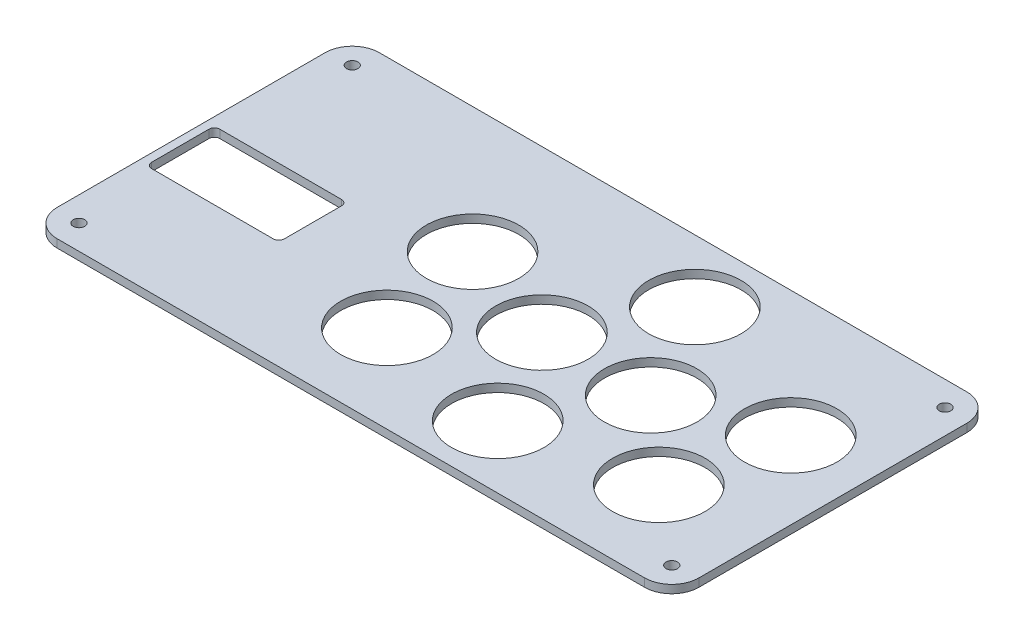
ISO-10303-21;
HEADER;
FILE_DESCRIPTION(('STEP AP214'),'2;1');
FILE_NAME('part.step','',(''),(''),'','','');
FILE_SCHEMA(('AUTOMOTIVE_DESIGN { 1 0 10303 214 1 1 1 1 }'));
ENDSEC;
DATA;
#1=APPLICATION_CONTEXT('core data for automotive mechanical design processes');
#2=APPLICATION_PROTOCOL_DEFINITION('international standard','automotive_design',2000,#1);
#3=PRODUCT_CONTEXT('',#1,'mechanical');
#4=PRODUCT('Part','Part','',(#3));
#5=PRODUCT_RELATED_PRODUCT_CATEGORY('part','',(#4));
#6=PRODUCT_DEFINITION_FORMATION('','',#4);
#7=PRODUCT_DEFINITION_CONTEXT('part definition',#1,'design');
#8=PRODUCT_DEFINITION('design','',#6,#7);
#9=PRODUCT_DEFINITION_SHAPE('','',#8);
#10=(LENGTH_UNIT() NAMED_UNIT(*) SI_UNIT(.MILLI.,.METRE.));
#11=(NAMED_UNIT(*) PLANE_ANGLE_UNIT() SI_UNIT($,.RADIAN.));
#12=(NAMED_UNIT(*) SI_UNIT($,.STERADIAN.) SOLID_ANGLE_UNIT());
#13=UNCERTAINTY_MEASURE_WITH_UNIT(LENGTH_MEASURE(1.E-05),#10,'distance_accuracy_value','');
#14=(GEOMETRIC_REPRESENTATION_CONTEXT(3) GLOBAL_UNCERTAINTY_ASSIGNED_CONTEXT((#13)) GLOBAL_UNIT_ASSIGNED_CONTEXT((#10,
#11,#12)) REPRESENTATION_CONTEXT('',''));
#15=CARTESIAN_POINT('',(0.,0.,0.));
#16=DIRECTION('',(0.,0.,1.));
#17=DIRECTION('',(1.,0.,0.));
#18=AXIS2_PLACEMENT_3D('',#15,#16,#17);
#19=CARTESIAN_POINT('',(0.,3.,-100.826085020235));
#20=DIRECTION('',(0.,0.,-1.));
#21=DIRECTION('',(-1.,0.,0.));
#22=AXIS2_PLACEMENT_3D('',#19,#20,#21);
#23=PLANE('',#22);
#24=DIRECTION('',(1.,0.,0.));
#25=VECTOR('',#24,1.);
#26=CARTESIAN_POINT('',(0.,3.,-100.826085020235));
#27=LINE('',#26,#25);
#28=CARTESIAN_POINT('',(-43.6645036271575,3.,-100.826085020235));
#29=VERTEX_POINT('',#28);
#30=CARTESIAN_POINT('',(172.335496372842,3.,-100.826085020235));
#31=VERTEX_POINT('',#30);
#32=EDGE_CURVE('E315',#29,#31,#27,.T.);
#33=ORIENTED_EDGE('',*,*,#32,.T.);
#34=DIRECTION('',(0.,-1.,0.));
#35=VECTOR('',#34,1.);
#36=CARTESIAN_POINT('',(172.335496372842,3.,-100.826085020235));
#37=LINE('',#36,#35);
#38=CARTESIAN_POINT('',(172.335496372842,0.,-100.826085020235));
#39=VERTEX_POINT('',#38);
#40=EDGE_CURVE('E207',#31,#39,#37,.T.);
#41=ORIENTED_EDGE('',*,*,#40,.T.);
#42=DIRECTION('',(1.,0.,0.));
#43=VECTOR('',#42,1.);
#44=CARTESIAN_POINT('',(0.,0.,-100.826085020235));
#45=LINE('',#44,#43);
#46=CARTESIAN_POINT('',(-43.6645036271575,0.,-100.826085020235));
#47=VERTEX_POINT('',#46);
#48=EDGE_CURVE('E165',#47,#39,#45,.T.);
#49=ORIENTED_EDGE('',*,*,#48,.F.);
#50=DIRECTION('',(0.,-1.,0.));
#51=VECTOR('',#50,1.);
#52=CARTESIAN_POINT('',(-43.6645036271575,3.,-100.826085020235));
#53=LINE('',#52,#51);
#54=EDGE_CURVE('E210',#47,#29,#53,.F.);
#55=ORIENTED_EDGE('',*,*,#54,.T.);
#56=EDGE_LOOP('',(#33,#41,#49,#55));
#57=FACE_BOUND('',#56,.T.);
#58=ADVANCED_FACE('F43',(#57),#23,.T.);
#59=CARTESIAN_POINT('',(-53.6645036271575,3.,0.));
#60=DIRECTION('',(1.,0.,0.));
#61=DIRECTION('',(0.,0.,-1.));
#62=AXIS2_PLACEMENT_3D('',#59,#60,#61);
#63=PLANE('',#62);
#64=DIRECTION('',(0.,0.,1.));
#65=VECTOR('',#64,1.);
#66=CARTESIAN_POINT('',(-53.6645036271575,3.,0.));
#67=LINE('',#66,#65);
#68=CARTESIAN_POINT('',(-53.6645036271575,3.,-90.8260850202347));
#69=VERTEX_POINT('',#68);
#70=CARTESIAN_POINT('',(-53.6645036271575,3.,7.67391497976526));
#71=VERTEX_POINT('',#70);
#72=EDGE_CURVE('E312',#69,#71,#67,.T.);
#73=ORIENTED_EDGE('',*,*,#72,.F.);
#74=DIRECTION('',(0.,-1.,0.));
#75=VECTOR('',#74,1.);
#76=CARTESIAN_POINT('',(-53.6645036271575,0.,-90.8260850202347));
#77=LINE('',#76,#75);
#78=CARTESIAN_POINT('',(-53.6645036271575,0.,-90.8260850202347));
#79=VERTEX_POINT('',#78);
#80=EDGE_CURVE('E213',#69,#79,#77,.T.);
#81=ORIENTED_EDGE('',*,*,#80,.T.);
#82=DIRECTION('',(0.,0.,1.));
#83=VECTOR('',#82,1.);
#84=CARTESIAN_POINT('',(-53.6645036271575,0.,0.));
#85=LINE('',#84,#83);
#86=CARTESIAN_POINT('',(-53.6645036271575,0.,7.67391497976526));
#87=VERTEX_POINT('',#86);
#88=EDGE_CURVE('E361',#79,#87,#85,.T.);
#89=ORIENTED_EDGE('',*,*,#88,.T.);
#90=DIRECTION('',(0.,-1.,0.));
#91=VECTOR('',#90,1.);
#92=CARTESIAN_POINT('',(-53.6645036271575,3.,7.67391497976526));
#93=LINE('',#92,#91);
#94=EDGE_CURVE('E211',#87,#71,#93,.F.);
#95=ORIENTED_EDGE('',*,*,#94,.T.);
#96=EDGE_LOOP('',(#73,#81,#89,#95));
#97=FACE_BOUND('',#96,.T.);
#98=ADVANCED_FACE('F382',(#97),#63,.F.);
#99=CARTESIAN_POINT('',(0.,3.,17.6739149797653));
#100=DIRECTION('',(0.,0.,-1.));
#101=DIRECTION('',(-1.,0.,0.));
#102=AXIS2_PLACEMENT_3D('',#99,#100,#101);
#103=PLANE('',#102);
#104=DIRECTION('',(1.,0.,0.));
#105=VECTOR('',#104,1.);
#106=CARTESIAN_POINT('',(0.,0.,17.6739149797653));
#107=LINE('',#106,#105);
#108=CARTESIAN_POINT('',(-43.6645036271575,0.,17.6739149797653));
#109=VERTEX_POINT('',#108);
#110=CARTESIAN_POINT('',(172.335496372843,0.,17.6739149797653));
#111=VERTEX_POINT('',#110);
#112=EDGE_CURVE('E178',#109,#111,#107,.T.);
#113=ORIENTED_EDGE('',*,*,#112,.T.);
#114=DIRECTION('',(0.,-1.,0.));
#115=VECTOR('',#114,1.);
#116=CARTESIAN_POINT('',(172.335496372843,3.,17.6739149797653));
#117=LINE('',#116,#115);
#118=CARTESIAN_POINT('',(172.335496372843,3.,17.6739149797653));
#119=VERTEX_POINT('',#118);
#120=EDGE_CURVE('E196',#111,#119,#117,.F.);
#121=ORIENTED_EDGE('',*,*,#120,.T.);
#122=DIRECTION('',(1.,0.,0.));
#123=VECTOR('',#122,1.);
#124=CARTESIAN_POINT('',(0.,3.,17.6739149797653));
#125=LINE('',#124,#123);
#126=CARTESIAN_POINT('',(-43.6645036271575,3.,17.6739149797653));
#127=VERTEX_POINT('',#126);
#128=EDGE_CURVE('E187',#127,#119,#125,.T.);
#129=ORIENTED_EDGE('',*,*,#128,.F.);
#130=DIRECTION('',(0.,-1.,0.));
#131=VECTOR('',#130,1.);
#132=CARTESIAN_POINT('',(-43.6645036271575,3.,17.6739149797653));
#133=LINE('',#132,#131);
#134=EDGE_CURVE('E194',#127,#109,#133,.T.);
#135=ORIENTED_EDGE('',*,*,#134,.T.);
#136=EDGE_LOOP('',(#113,#121,#129,#135));
#137=FACE_BOUND('',#136,.T.);
#138=ADVANCED_FACE('F369',(#137),#103,.F.);
#139=CARTESIAN_POINT('',(-50.6645036271575,3.,0.));
#140=DIRECTION('',(1.,0.,0.));
#141=DIRECTION('',(0.,0.,-1.));
#142=AXIS2_PLACEMENT_3D('',#139,#140,#141);
#143=PLANE('',#142);
#144=DIRECTION('',(0.,0.,1.));
#145=VECTOR('',#144,1.);
#146=CARTESIAN_POINT('',(-50.6645036271575,3.,0.));
#147=LINE('',#146,#145);
#148=CARTESIAN_POINT('',(-50.6645036271575,3.,-45.1260850202347));
#149=VERTEX_POINT('',#148);
#150=CARTESIAN_POINT('',(-50.6645036271575,3.,-24.0260850202347));
#151=VERTEX_POINT('',#150);
#152=EDGE_CURVE('E177',#149,#151,#147,.T.);
#153=ORIENTED_EDGE('',*,*,#152,.T.);
#154=DIRECTION('',(0.,-1.,0.));
#155=VECTOR('',#154,1.);
#156=CARTESIAN_POINT('',(-50.6645036271575,0.,-24.0260850202347));
#157=LINE('',#156,#155);
#158=CARTESIAN_POINT('',(-50.6645036271575,0.,-24.0260850202347));
#159=VERTEX_POINT('',#158);
#160=EDGE_CURVE('E227',#151,#159,#157,.T.);
#161=ORIENTED_EDGE('',*,*,#160,.T.);
#162=DIRECTION('',(0.,0.,1.));
#163=VECTOR('',#162,1.);
#164=CARTESIAN_POINT('',(-50.6645036271575,0.,0.));
#165=LINE('',#164,#163);
#166=CARTESIAN_POINT('',(-50.6645036271575,0.,-45.1260850202347));
#167=VERTEX_POINT('',#166);
#168=EDGE_CURVE('E258',#167,#159,#165,.T.);
#169=ORIENTED_EDGE('',*,*,#168,.F.);
#170=DIRECTION('',(0.,-1.,0.));
#171=VECTOR('',#170,1.);
#172=CARTESIAN_POINT('',(-50.6645036271575,3.,-45.1260850202347));
#173=LINE('',#172,#171);
#174=EDGE_CURVE('E228',#167,#149,#173,.F.);
#175=ORIENTED_EDGE('',*,*,#174,.T.);
#176=EDGE_LOOP('',(#153,#161,#169,#175));
#177=FACE_BOUND('',#176,.T.);
#178=ADVANCED_FACE('F454',(#177),#143,.T.);
#179=CARTESIAN_POINT('',(0.,3.,-47.1260850202347));
#180=DIRECTION('',(0.,0.,-1.));
#181=DIRECTION('',(-1.,0.,0.));
#182=AXIS2_PLACEMENT_3D('',#179,#180,#181);
#183=PLANE('',#182);
#184=DIRECTION('',(1.,0.,0.));
#185=VECTOR('',#184,1.);
#186=CARTESIAN_POINT('',(0.,3.,-47.1260850202347));
#187=LINE('',#186,#185);
#188=CARTESIAN_POINT('',(-48.6645036271575,3.,-47.1260850202347));
#189=VERTEX_POINT('',#188);
#190=CARTESIAN_POINT('',(-3.86450362715749,3.,-47.1260850202347));
#191=VERTEX_POINT('',#190);
#192=EDGE_CURVE('E264',#189,#191,#187,.T.);
#193=ORIENTED_EDGE('',*,*,#192,.F.);
#194=DIRECTION('',(0.,-1.,0.));
#195=VECTOR('',#194,1.);
#196=CARTESIAN_POINT('',(-48.6645036271575,3.,-47.1260850202347));
#197=LINE('',#196,#195);
#198=CARTESIAN_POINT('',(-48.6645036271575,0.,-47.1260850202347));
#199=VERTEX_POINT('',#198);
#200=EDGE_CURVE('E235',#189,#199,#197,.T.);
#201=ORIENTED_EDGE('',*,*,#200,.T.);
#202=DIRECTION('',(1.,0.,0.));
#203=VECTOR('',#202,1.);
#204=CARTESIAN_POINT('',(0.,0.,-47.1260850202347));
#205=LINE('',#204,#203);
#206=CARTESIAN_POINT('',(-3.86450362715749,0.,-47.1260850202347));
#207=VERTEX_POINT('',#206);
#208=EDGE_CURVE('E248',#199,#207,#205,.T.);
#209=ORIENTED_EDGE('',*,*,#208,.T.);
#210=DIRECTION('',(0.,-1.,0.));
#211=VECTOR('',#210,1.);
#212=CARTESIAN_POINT('',(-3.86450362715749,3.,-47.1260850202347));
#213=LINE('',#212,#211);
#214=EDGE_CURVE('E59',#207,#191,#213,.F.);
#215=ORIENTED_EDGE('',*,*,#214,.T.);
#216=EDGE_LOOP('',(#193,#201,#209,#215));
#217=FACE_BOUND('',#216,.T.);
#218=ADVANCED_FACE('F255',(#217),#183,.F.);
#219=CARTESIAN_POINT('',(-1.86450362715748,3.,0.));
#220=DIRECTION('',(1.,0.,0.));
#221=DIRECTION('',(0.,0.,-1.));
#222=AXIS2_PLACEMENT_3D('',#219,#220,#221);
#223=PLANE('',#222);
#224=DIRECTION('',(0.,0.,1.));
#225=VECTOR('',#224,1.);
#226=CARTESIAN_POINT('',(-1.86450362715748,0.,0.));
#227=LINE('',#226,#225);
#228=CARTESIAN_POINT('',(-1.86450362715749,0.,-45.1260850202347));
#229=VERTEX_POINT('',#228);
#230=CARTESIAN_POINT('',(-1.86450362715748,0.,-24.0260850202347));
#231=VERTEX_POINT('',#230);
#232=EDGE_CURVE('E253',#229,#231,#227,.T.);
#233=ORIENTED_EDGE('',*,*,#232,.T.);
#234=DIRECTION('',(0.,-1.,0.));
#235=VECTOR('',#234,1.);
#236=CARTESIAN_POINT('',(-1.86450362715748,3.,-24.0260850202347));
#237=LINE('',#236,#235);
#238=CARTESIAN_POINT('',(-1.86450362715748,3.,-24.0260850202347));
#239=VERTEX_POINT('',#238);
#240=EDGE_CURVE('E221',#231,#239,#237,.F.);
#241=ORIENTED_EDGE('',*,*,#240,.T.);
#242=DIRECTION('',(0.,0.,1.));
#243=VECTOR('',#242,1.);
#244=CARTESIAN_POINT('',(-1.86450362715748,3.,0.));
#245=LINE('',#244,#243);
#246=CARTESIAN_POINT('',(-1.86450362715749,3.,-45.1260850202347));
#247=VERTEX_POINT('',#246);
#248=EDGE_CURVE('E263',#247,#239,#245,.T.);
#249=ORIENTED_EDGE('',*,*,#248,.F.);
#250=DIRECTION('',(0.,-1.,0.));
#251=VECTOR('',#250,1.);
#252=CARTESIAN_POINT('',(-1.86450362715749,0.,-45.1260850202347));
#253=LINE('',#252,#251);
#254=EDGE_CURVE('E222',#247,#229,#253,.T.);
#255=ORIENTED_EDGE('',*,*,#254,.T.);
#256=EDGE_LOOP('',(#233,#241,#249,#255));
#257=FACE_BOUND('',#256,.T.);
#258=ADVANCED_FACE('F270',(#257),#223,.F.);
#259=CARTESIAN_POINT('',(173.335496372843,3.,8.6739149797652));
#260=DIRECTION('',(0.,-1.,0.));
#261=DIRECTION('',(0.,0.,-1.));
#262=AXIS2_PLACEMENT_3D('',#259,#260,#261);
#263=CYLINDRICAL_SURFACE('',#262,2.125);
#264=CARTESIAN_POINT('',(173.335496372843,3.,8.6739149797652));
#265=DIRECTION('',(0.,1.,0.));
#266=DIRECTION('',(0.,0.,1.));
#267=AXIS2_PLACEMENT_3D('',#264,#265,#266);
#268=CIRCLE('',#267,2.125);
#269=CARTESIAN_POINT('',(173.335496372843,3.,10.7989149797652));
#270=VERTEX_POINT('',#269);
#271=EDGE_CURVE('E310',#270,#270,#268,.F.);
#272=ORIENTED_EDGE('',*,*,#271,.F.);
#273=EDGE_LOOP('',(#272));
#274=FACE_BOUND('',#273,.T.);
#275=CARTESIAN_POINT('',(173.335496372843,0.,8.6739149797652));
#276=DIRECTION('',(0.,1.,0.));
#277=DIRECTION('',(0.,0.,1.));
#278=AXIS2_PLACEMENT_3D('',#275,#276,#277);
#279=CIRCLE('',#278,2.125);
#280=CARTESIAN_POINT('',(173.335496372843,0.,10.7989149797652));
#281=VERTEX_POINT('',#280);
#282=EDGE_CURVE('E358',#281,#281,#279,.F.);
#283=ORIENTED_EDGE('',*,*,#282,.T.);
#284=EDGE_LOOP('',(#283));
#285=FACE_BOUND('',#284,.T.);
#286=ADVANCED_FACE('F399',(#274,#285),#263,.F.);
#287=CARTESIAN_POINT('',(173.335496372842,3.,-91.8260850202348));
#288=DIRECTION('',(0.,-1.,0.));
#289=DIRECTION('',(0.,0.,-1.));
#290=AXIS2_PLACEMENT_3D('',#287,#288,#289);
#291=CYLINDRICAL_SURFACE('',#290,2.125);
#292=CARTESIAN_POINT('',(173.335496372842,3.,-91.8260850202348));
#293=DIRECTION('',(0.,1.,0.));
#294=DIRECTION('',(0.,0.,1.));
#295=AXIS2_PLACEMENT_3D('',#292,#293,#294);
#296=CIRCLE('',#295,2.125);
#297=CARTESIAN_POINT('',(173.335496372842,3.,-89.7010850202348));
#298=VERTEX_POINT('',#297);
#299=EDGE_CURVE('E308',#298,#298,#296,.T.);
#300=ORIENTED_EDGE('',*,*,#299,.T.);
#301=EDGE_LOOP('',(#300));
#302=FACE_BOUND('',#301,.T.);
#303=CARTESIAN_POINT('',(173.335496372842,0.,-91.8260850202348));
#304=DIRECTION('',(0.,1.,0.));
#305=DIRECTION('',(0.,0.,1.));
#306=AXIS2_PLACEMENT_3D('',#303,#304,#305);
#307=CIRCLE('',#306,2.125);
#308=CARTESIAN_POINT('',(173.335496372842,0.,-89.7010850202348));
#309=VERTEX_POINT('',#308);
#310=EDGE_CURVE('E356',#309,#309,#307,.T.);
#311=ORIENTED_EDGE('',*,*,#310,.F.);
#312=EDGE_LOOP('',(#311));
#313=FACE_BOUND('',#312,.T.);
#314=ADVANCED_FACE('F401',(#302,#313),#291,.F.);
#315=CARTESIAN_POINT('',(36.8354963728425,3.,-54.5760850202347));
#316=DIRECTION('',(0.,-1.,0.));
#317=DIRECTION('',(0.,0.,-1.));
#318=AXIS2_PLACEMENT_3D('',#315,#316,#317);
#319=CYLINDRICAL_SURFACE('',#318,17.);
#320=CARTESIAN_POINT('',(36.8354963728425,3.,-54.5760850202347));
#321=DIRECTION('',(0.,1.,0.));
#322=DIRECTION('',(0.,0.,1.));
#323=AXIS2_PLACEMENT_3D('',#320,#321,#322);
#324=CIRCLE('',#323,17.);
#325=CARTESIAN_POINT('',(36.8354963728425,3.,-37.5760850202347));
#326=VERTEX_POINT('',#325);
#327=EDGE_CURVE('E302',#326,#326,#324,.T.);
#328=ORIENTED_EDGE('',*,*,#327,.T.);
#329=EDGE_LOOP('',(#328));
#330=FACE_BOUND('',#329,.T.);
#331=CARTESIAN_POINT('',(36.8354963728425,0.,-54.5760850202347));
#332=DIRECTION('',(0.,1.,0.));
#333=DIRECTION('',(0.,0.,1.));
#334=AXIS2_PLACEMENT_3D('',#331,#332,#333);
#335=CIRCLE('',#334,17.);
#336=CARTESIAN_POINT('',(36.8354963728425,0.,-37.5760850202347));
#337=VERTEX_POINT('',#336);
#338=EDGE_CURVE('E352',#337,#337,#335,.T.);
#339=ORIENTED_EDGE('',*,*,#338,.F.);
#340=EDGE_LOOP('',(#339));
#341=FACE_BOUND('',#340,.T.);
#342=ADVANCED_FACE('F409',(#330,#341),#319,.F.);
#343=CARTESIAN_POINT('',(45.3354963728425,3.,-14.5760850202347));
#344=DIRECTION('',(0.,-1.,0.));
#345=DIRECTION('',(0.,0.,-1.));
#346=AXIS2_PLACEMENT_3D('',#343,#344,#345);
#347=CYLINDRICAL_SURFACE('',#346,17.);
#348=CARTESIAN_POINT('',(45.3354963728425,3.,-14.5760850202347));
#349=DIRECTION('',(0.,1.,0.));
#350=DIRECTION('',(0.,0.,1.));
#351=AXIS2_PLACEMENT_3D('',#348,#349,#350);
#352=CIRCLE('',#351,17.);
#353=CARTESIAN_POINT('',(45.3354963728425,3.,2.42391497976526));
#354=VERTEX_POINT('',#353);
#355=EDGE_CURVE('E296',#354,#354,#352,.T.);
#356=ORIENTED_EDGE('',*,*,#355,.T.);
#357=EDGE_LOOP('',(#356));
#358=FACE_BOUND('',#357,.T.);
#359=CARTESIAN_POINT('',(45.3354963728425,0.,-14.5760850202347));
#360=DIRECTION('',(0.,1.,0.));
#361=DIRECTION('',(0.,0.,1.));
#362=AXIS2_PLACEMENT_3D('',#359,#360,#361);
#363=CIRCLE('',#362,17.);
#364=CARTESIAN_POINT('',(45.3354963728425,0.,2.42391497976526));
#365=VERTEX_POINT('',#364);
#366=EDGE_CURVE('E348',#365,#365,#363,.T.);
#367=ORIENTED_EDGE('',*,*,#366,.F.);
#368=EDGE_LOOP('',(#367));
#369=FACE_BOUND('',#368,.T.);
#370=ADVANCED_FACE('F411',(#358,#369),#347,.F.);
#371=CARTESIAN_POINT('',(145.335496372843,3.,-14.5760850202347));
#372=DIRECTION('',(0.,-1.,0.));
#373=DIRECTION('',(0.,0.,-1.));
#374=AXIS2_PLACEMENT_3D('',#371,#372,#373);
#375=CYLINDRICAL_SURFACE('',#374,17.);
#376=CARTESIAN_POINT('',(145.335496372843,3.,-14.5760850202347));
#377=DIRECTION('',(0.,1.,0.));
#378=DIRECTION('',(0.,0.,1.));
#379=AXIS2_PLACEMENT_3D('',#376,#377,#378);
#380=CIRCLE('',#379,17.);
#381=CARTESIAN_POINT('',(145.335496372843,3.,2.42391497976525));
#382=VERTEX_POINT('',#381);
#383=EDGE_CURVE('E299',#382,#382,#380,.T.);
#384=ORIENTED_EDGE('',*,*,#383,.T.);
#385=EDGE_LOOP('',(#384));
#386=FACE_BOUND('',#385,.T.);
#387=CARTESIAN_POINT('',(145.335496372843,0.,-14.5760850202347));
#388=DIRECTION('',(0.,1.,0.));
#389=DIRECTION('',(0.,0.,1.));
#390=AXIS2_PLACEMENT_3D('',#387,#388,#389);
#391=CIRCLE('',#390,17.);
#392=CARTESIAN_POINT('',(145.335496372843,0.,2.42391497976525));
#393=VERTEX_POINT('',#392);
#394=EDGE_CURVE('E350',#393,#393,#391,.T.);
#395=ORIENTED_EDGE('',*,*,#394,.F.);
#396=EDGE_LOOP('',(#395));
#397=FACE_BOUND('',#396,.T.);
#398=ADVANCED_FACE('F414',(#386,#397),#375,.F.);
#399=CARTESIAN_POINT('',(75.3354963728425,3.,-41.5760850202347));
#400=DIRECTION('',(0.,-1.,0.));
#401=DIRECTION('',(0.,0.,-1.));
#402=AXIS2_PLACEMENT_3D('',#399,#400,#401);
#403=CYLINDRICAL_SURFACE('',#402,17.);
#404=CARTESIAN_POINT('',(75.3354963728425,3.,-41.5760850202347));
#405=DIRECTION('',(0.,1.,0.));
#406=DIRECTION('',(0.,0.,1.));
#407=AXIS2_PLACEMENT_3D('',#404,#405,#406);
#408=CIRCLE('',#407,17.);
#409=CARTESIAN_POINT('',(75.3354963728425,3.,-24.5760850202347));
#410=VERTEX_POINT('',#409);
#411=EDGE_CURVE('E294',#410,#410,#408,.T.);
#412=ORIENTED_EDGE('',*,*,#411,.T.);
#413=EDGE_LOOP('',(#412));
#414=FACE_BOUND('',#413,.T.);
#415=CARTESIAN_POINT('',(75.3354963728425,0.,-41.5760850202347));
#416=DIRECTION('',(0.,1.,0.));
#417=DIRECTION('',(0.,0.,1.));
#418=AXIS2_PLACEMENT_3D('',#415,#416,#417);
#419=CIRCLE('',#418,17.);
#420=CARTESIAN_POINT('',(75.3354963728425,0.,-24.5760850202347));
#421=VERTEX_POINT('',#420);
#422=EDGE_CURVE('E343',#421,#421,#419,.T.);
#423=ORIENTED_EDGE('',*,*,#422,.F.);
#424=EDGE_LOOP('',(#423));
#425=FACE_BOUND('',#424,.T.);
#426=ADVANCED_FACE('F420',(#414,#425),#403,.F.);
#427=CARTESIAN_POINT('',(115.335496372843,3.,-41.5760850202347));
#428=DIRECTION('',(0.,-1.,0.));
#429=DIRECTION('',(0.,0.,-1.));
#430=AXIS2_PLACEMENT_3D('',#427,#428,#429);
#431=CYLINDRICAL_SURFACE('',#430,17.);
#432=CARTESIAN_POINT('',(115.335496372843,3.,-41.5760850202347));
#433=DIRECTION('',(0.,1.,0.));
#434=DIRECTION('',(0.,0.,1.));
#435=AXIS2_PLACEMENT_3D('',#432,#433,#434);
#436=CIRCLE('',#435,17.);
#437=CARTESIAN_POINT('',(115.335496372843,3.,-24.5760850202347));
#438=VERTEX_POINT('',#437);
#439=EDGE_CURVE('E292',#438,#438,#436,.T.);
#440=ORIENTED_EDGE('',*,*,#439,.T.);
#441=EDGE_LOOP('',(#440));
#442=FACE_BOUND('',#441,.T.);
#443=CARTESIAN_POINT('',(115.335496372843,0.,-41.5760850202347));
#444=DIRECTION('',(0.,1.,0.));
#445=DIRECTION('',(0.,0.,1.));
#446=AXIS2_PLACEMENT_3D('',#443,#444,#445);
#447=CIRCLE('',#446,17.);
#448=CARTESIAN_POINT('',(115.335496372843,0.,-24.5760850202347));
#449=VERTEX_POINT('',#448);
#450=EDGE_CURVE('E341',#449,#449,#447,.T.);
#451=ORIENTED_EDGE('',*,*,#450,.F.);
#452=EDGE_LOOP('',(#451));
#453=FACE_BOUND('',#452,.T.);
#454=ADVANCED_FACE('F421',(#442,#453),#431,.F.);
#455=CARTESIAN_POINT('',(95.3354963728425,3.,-5.32608502023475));
#456=DIRECTION('',(0.,-1.,0.));
#457=DIRECTION('',(0.,0.,-1.));
#458=AXIS2_PLACEMENT_3D('',#455,#456,#457);
#459=CYLINDRICAL_SURFACE('',#458,17.);
#460=CARTESIAN_POINT('',(95.3354963728425,3.,-5.32608502023475));
#461=DIRECTION('',(0.,1.,0.));
#462=DIRECTION('',(0.,0.,1.));
#463=AXIS2_PLACEMENT_3D('',#460,#461,#462);
#464=CIRCLE('',#463,17.);
#465=CARTESIAN_POINT('',(95.3354963728425,3.,11.6739149797653));
#466=VERTEX_POINT('',#465);
#467=EDGE_CURVE('E287',#466,#466,#464,.T.);
#468=ORIENTED_EDGE('',*,*,#467,.T.);
#469=EDGE_LOOP('',(#468));
#470=FACE_BOUND('',#469,.T.);
#471=CARTESIAN_POINT('',(95.3354963728425,0.,-5.32608502023475));
#472=DIRECTION('',(0.,1.,0.));
#473=DIRECTION('',(0.,0.,1.));
#474=AXIS2_PLACEMENT_3D('',#471,#472,#473);
#475=CIRCLE('',#474,17.);
#476=CARTESIAN_POINT('',(95.3354963728425,0.,11.6739149797653));
#477=VERTEX_POINT('',#476);
#478=EDGE_CURVE('E337',#477,#477,#475,.T.);
#479=ORIENTED_EDGE('',*,*,#478,.F.);
#480=EDGE_LOOP('',(#479));
#481=FACE_BOUND('',#480,.T.);
#482=ADVANCED_FACE('F430',(#470,#481),#459,.F.);
#483=CARTESIAN_POINT('',(153.835496372843,3.,-54.5760850202347));
#484=DIRECTION('',(0.,-1.,0.));
#485=DIRECTION('',(0.,0.,-1.));
#486=AXIS2_PLACEMENT_3D('',#483,#484,#485);
#487=CYLINDRICAL_SURFACE('',#486,17.);
#488=CARTESIAN_POINT('',(153.835496372843,3.,-54.5760850202347));
#489=DIRECTION('',(0.,1.,0.));
#490=DIRECTION('',(0.,0.,1.));
#491=AXIS2_PLACEMENT_3D('',#488,#489,#490);
#492=CIRCLE('',#491,17.);
#493=CARTESIAN_POINT('',(153.835496372843,3.,-37.5760850202347));
#494=VERTEX_POINT('',#493);
#495=EDGE_CURVE('E281',#494,#494,#492,.T.);
#496=ORIENTED_EDGE('',*,*,#495,.T.);
#497=EDGE_LOOP('',(#496));
#498=FACE_BOUND('',#497,.T.);
#499=CARTESIAN_POINT('',(153.835496372843,0.,-54.5760850202347));
#500=DIRECTION('',(0.,1.,0.));
#501=DIRECTION('',(0.,0.,1.));
#502=AXIS2_PLACEMENT_3D('',#499,#500,#501);
#503=CIRCLE('',#502,17.);
#504=CARTESIAN_POINT('',(153.835496372843,0.,-37.5760850202347));
#505=VERTEX_POINT('',#504);
#506=EDGE_CURVE('E333',#505,#505,#503,.T.);
#507=ORIENTED_EDGE('',*,*,#506,.F.);
#508=EDGE_LOOP('',(#507));
#509=FACE_BOUND('',#508,.T.);
#510=ADVANCED_FACE('F431',(#498,#509),#487,.F.);
#511=CARTESIAN_POINT('',(95.3354963728425,3.,-77.8260850202347));
#512=DIRECTION('',(0.,-1.,0.));
#513=DIRECTION('',(0.,0.,-1.));
#514=AXIS2_PLACEMENT_3D('',#511,#512,#513);
#515=CYLINDRICAL_SURFACE('',#514,17.);
#516=CARTESIAN_POINT('',(95.3354963728425,3.,-77.8260850202347));
#517=DIRECTION('',(0.,1.,0.));
#518=DIRECTION('',(0.,0.,1.));
#519=AXIS2_PLACEMENT_3D('',#516,#517,#518);
#520=CIRCLE('',#519,17.);
#521=CARTESIAN_POINT('',(95.3354963728425,3.,-60.8260850202347));
#522=VERTEX_POINT('',#521);
#523=EDGE_CURVE('E284',#522,#522,#520,.T.);
#524=ORIENTED_EDGE('',*,*,#523,.T.);
#525=EDGE_LOOP('',(#524));
#526=FACE_BOUND('',#525,.T.);
#527=CARTESIAN_POINT('',(95.3354963728425,0.,-77.8260850202347));
#528=DIRECTION('',(0.,1.,0.));
#529=DIRECTION('',(0.,0.,1.));
#530=AXIS2_PLACEMENT_3D('',#527,#528,#529);
#531=CIRCLE('',#530,17.);
#532=CARTESIAN_POINT('',(95.3354963728425,0.,-60.8260850202347));
#533=VERTEX_POINT('',#532);
#534=EDGE_CURVE('E335',#533,#533,#531,.T.);
#535=ORIENTED_EDGE('',*,*,#534,.F.);
#536=EDGE_LOOP('',(#535));
#537=FACE_BOUND('',#536,.T.);
#538=ADVANCED_FACE('F434',(#526,#537),#515,.F.);
#539=CARTESIAN_POINT('',(-44.6645036271575,3.,8.67391497976526));
#540=DIRECTION('',(0.,-1.,0.));
#541=DIRECTION('',(0.,0.,-1.));
#542=AXIS2_PLACEMENT_3D('',#539,#540,#541);
#543=CYLINDRICAL_SURFACE('',#542,2.125);
#544=CARTESIAN_POINT('',(-44.6645036271575,3.,8.67391497976526));
#545=DIRECTION('',(0.,1.,0.));
#546=DIRECTION('',(0.,0.,1.));
#547=AXIS2_PLACEMENT_3D('',#544,#545,#546);
#548=CIRCLE('',#547,2.125);
#549=CARTESIAN_POINT('',(-44.6645036271575,3.,10.7989149797653));
#550=VERTEX_POINT('',#549);
#551=EDGE_CURVE('E276',#550,#550,#548,.T.);
#552=ORIENTED_EDGE('',*,*,#551,.T.);
#553=EDGE_LOOP('',(#552));
#554=FACE_BOUND('',#553,.T.);
#555=CARTESIAN_POINT('',(-44.6645036271575,0.,8.67391497976526));
#556=DIRECTION('',(0.,1.,0.));
#557=DIRECTION('',(0.,0.,1.));
#558=AXIS2_PLACEMENT_3D('',#555,#556,#557);
#559=CIRCLE('',#558,2.125);
#560=CARTESIAN_POINT('',(-44.6645036271575,0.,10.7989149797653));
#561=VERTEX_POINT('',#560);
#562=EDGE_CURVE('E328',#561,#561,#559,.T.);
#563=ORIENTED_EDGE('',*,*,#562,.F.);
#564=EDGE_LOOP('',(#563));
#565=FACE_BOUND('',#564,.T.);
#566=ADVANCED_FACE('F438',(#554,#565),#543,.F.);
#567=CARTESIAN_POINT('',(-44.6645036271575,3.,-91.8260850202347));
#568=DIRECTION('',(0.,-1.,0.));
#569=DIRECTION('',(0.,0.,-1.));
#570=AXIS2_PLACEMENT_3D('',#567,#568,#569);
#571=CYLINDRICAL_SURFACE('',#570,2.125);
#572=CARTESIAN_POINT('',(-44.6645036271575,3.,-91.8260850202347));
#573=DIRECTION('',(0.,1.,0.));
#574=DIRECTION('',(0.,0.,1.));
#575=AXIS2_PLACEMENT_3D('',#572,#573,#574);
#576=CIRCLE('',#575,2.125);
#577=CARTESIAN_POINT('',(-44.6645036271575,3.,-89.7010850202347));
#578=VERTEX_POINT('',#577);
#579=EDGE_CURVE('E275',#578,#578,#576,.F.);
#580=ORIENTED_EDGE('',*,*,#579,.F.);
#581=EDGE_LOOP('',(#580));
#582=FACE_BOUND('',#581,.T.);
#583=CARTESIAN_POINT('',(-44.6645036271575,0.,-91.8260850202347));
#584=DIRECTION('',(0.,1.,0.));
#585=DIRECTION('',(0.,0.,1.));
#586=AXIS2_PLACEMENT_3D('',#583,#584,#585);
#587=CIRCLE('',#586,2.125);
#588=CARTESIAN_POINT('',(-44.6645036271575,0.,-89.7010850202347));
#589=VERTEX_POINT('',#588);
#590=EDGE_CURVE('E326',#589,#589,#587,.F.);
#591=ORIENTED_EDGE('',*,*,#590,.T.);
#592=EDGE_LOOP('',(#591));
#593=FACE_BOUND('',#592,.T.);
#594=ADVANCED_FACE('F444',(#582,#593),#571,.F.);
#595=CARTESIAN_POINT('',(0.,3.,-22.0260850202347));
#596=DIRECTION('',(0.,0.,-1.));
#597=DIRECTION('',(-1.,0.,0.));
#598=AXIS2_PLACEMENT_3D('',#595,#596,#597);
#599=PLANE('',#598);
#600=DIRECTION('',(1.,0.,0.));
#601=VECTOR('',#600,1.);
#602=CARTESIAN_POINT('',(0.,3.,-22.0260850202347));
#603=LINE('',#602,#601);
#604=CARTESIAN_POINT('',(-48.6645036271575,3.,-22.0260850202347));
#605=VERTEX_POINT('',#604);
#606=CARTESIAN_POINT('',(-3.86450362715748,3.,-22.0260850202347));
#607=VERTEX_POINT('',#606);
#608=EDGE_CURVE('E267',#605,#607,#603,.T.);
#609=ORIENTED_EDGE('',*,*,#608,.T.);
#610=DIRECTION('',(0.,-1.,0.));
#611=VECTOR('',#610,1.);
#612=CARTESIAN_POINT('',(-3.86450362715748,3.,-22.0260850202347));
#613=LINE('',#612,#611);
#614=CARTESIAN_POINT('',(-3.86450362715748,0.,-22.0260850202347));
#615=VERTEX_POINT('',#614);
#616=EDGE_CURVE('E217',#607,#615,#613,.T.);
#617=ORIENTED_EDGE('',*,*,#616,.T.);
#618=DIRECTION('',(1.,0.,0.));
#619=VECTOR('',#618,1.);
#620=CARTESIAN_POINT('',(0.,0.,-22.0260850202347));
#621=LINE('',#620,#619);
#622=CARTESIAN_POINT('',(-48.6645036271575,0.,-22.0260850202347));
#623=VERTEX_POINT('',#622);
#624=EDGE_CURVE('E323',#623,#615,#621,.T.);
#625=ORIENTED_EDGE('',*,*,#624,.F.);
#626=DIRECTION('',(0.,-1.,0.));
#627=VECTOR('',#626,1.);
#628=CARTESIAN_POINT('',(-48.6645036271575,3.,-22.0260850202347));
#629=LINE('',#628,#627);
#630=EDGE_CURVE('E216',#623,#605,#629,.F.);
#631=ORIENTED_EDGE('',*,*,#630,.T.);
#632=EDGE_LOOP('',(#609,#617,#625,#631));
#633=FACE_BOUND('',#632,.T.);
#634=ADVANCED_FACE('F448',(#633),#599,.T.);
#635=CARTESIAN_POINT('',(182.335496372843,3.,0.));
#636=DIRECTION('',(1.,0.,0.));
#637=DIRECTION('',(0.,0.,-1.));
#638=AXIS2_PLACEMENT_3D('',#635,#636,#637);
#639=PLANE('',#638);
#640=DIRECTION('',(0.,0.,1.));
#641=VECTOR('',#640,1.);
#642=CARTESIAN_POINT('',(182.335496372843,3.,0.));
#643=LINE('',#642,#641);
#644=CARTESIAN_POINT('',(182.335496372843,3.,-90.8260850202347));
#645=VERTEX_POINT('',#644);
#646=CARTESIAN_POINT('',(182.335496372843,3.,7.67391497976525));
#647=VERTEX_POINT('',#646);
#648=EDGE_CURVE('E184',#645,#647,#643,.T.);
#649=ORIENTED_EDGE('',*,*,#648,.T.);
#650=DIRECTION('',(0.,-1.,0.));
#651=VECTOR('',#650,1.);
#652=CARTESIAN_POINT('',(182.335496372843,0.,7.67391497976525));
#653=LINE('',#652,#651);
#654=CARTESIAN_POINT('',(182.335496372843,0.,7.67391497976525));
#655=VERTEX_POINT('',#654);
#656=EDGE_CURVE('E180',#647,#655,#653,.T.);
#657=ORIENTED_EDGE('',*,*,#656,.T.);
#658=DIRECTION('',(0.,0.,1.));
#659=VECTOR('',#658,1.);
#660=CARTESIAN_POINT('',(182.335496372843,0.,0.));
#661=LINE('',#660,#659);
#662=CARTESIAN_POINT('',(182.335496372843,0.,-90.8260850202347));
#663=VERTEX_POINT('',#662);
#664=EDGE_CURVE('E159',#663,#655,#661,.T.);
#665=ORIENTED_EDGE('',*,*,#664,.F.);
#666=DIRECTION('',(0.,-1.,0.));
#667=VECTOR('',#666,1.);
#668=CARTESIAN_POINT('',(182.335496372843,3.,-90.8260850202347));
#669=LINE('',#668,#667);
#670=EDGE_CURVE('E175',#663,#645,#669,.F.);
#671=ORIENTED_EDGE('',*,*,#670,.T.);
#672=EDGE_LOOP('',(#649,#657,#665,#671));
#673=FACE_BOUND('',#672,.T.);
#674=ADVANCED_FACE('F172',(#673),#639,.T.);
#675=CARTESIAN_POINT('',(0.,3.,0.));
#676=DIRECTION('',(0.,1.,0.));
#677=DIRECTION('',(0.,0.,1.));
#678=AXIS2_PLACEMENT_3D('',#675,#676,#677);
#679=PLANE('',#678);
#680=ORIENTED_EDGE('',*,*,#152,.F.);
#681=CARTESIAN_POINT('',(-48.6645036271575,3.,-45.1260850202347));
#682=DIRECTION('',(0.,1.,0.));
#683=DIRECTION('',(0.,0.,1.));
#684=AXIS2_PLACEMENT_3D('',#681,#682,#683);
#685=CIRCLE('',#684,2.);
#686=EDGE_CURVE('E61',#149,#189,#685,.F.);
#687=ORIENTED_EDGE('',*,*,#686,.T.);
#688=ORIENTED_EDGE('',*,*,#192,.T.);
#689=CARTESIAN_POINT('',(-3.86450362715749,3.,-45.1260850202347));
#690=DIRECTION('',(0.,1.,0.));
#691=DIRECTION('',(0.,0.,1.));
#692=AXIS2_PLACEMENT_3D('',#689,#690,#691);
#693=CIRCLE('',#692,2.);
#694=EDGE_CURVE('E11',#191,#247,#693,.F.);
#695=ORIENTED_EDGE('',*,*,#694,.T.);
#696=ORIENTED_EDGE('',*,*,#248,.T.);
#697=CARTESIAN_POINT('',(-3.86450362715748,3.,-24.0260850202347));
#698=DIRECTION('',(0.,1.,0.));
#699=DIRECTION('',(0.,0.,1.));
#700=AXIS2_PLACEMENT_3D('',#697,#698,#699);
#701=CIRCLE('',#700,2.);
#702=EDGE_CURVE('E240',#239,#607,#701,.F.);
#703=ORIENTED_EDGE('',*,*,#702,.T.);
#704=ORIENTED_EDGE('',*,*,#608,.F.);
#705=CARTESIAN_POINT('',(-48.6645036271575,3.,-24.0260850202347));
#706=DIRECTION('',(0.,1.,0.));
#707=DIRECTION('',(0.,0.,1.));
#708=AXIS2_PLACEMENT_3D('',#705,#706,#707);
#709=CIRCLE('',#708,2.);
#710=EDGE_CURVE('E243',#605,#151,#709,.F.);
#711=ORIENTED_EDGE('',*,*,#710,.T.);
#712=EDGE_LOOP('',(#680,#687,#688,#695,#696,#703,#704,#711));
#713=FACE_BOUND('',#712,.T.);
#714=ORIENTED_EDGE('',*,*,#579,.T.);
#715=EDGE_LOOP('',(#714));
#716=FACE_BOUND('',#715,.T.);
#717=ORIENTED_EDGE('',*,*,#551,.F.);
#718=EDGE_LOOP('',(#717));
#719=FACE_BOUND('',#718,.T.);
#720=ORIENTED_EDGE('',*,*,#523,.F.);
#721=EDGE_LOOP('',(#720));
#722=FACE_BOUND('',#721,.T.);
#723=ORIENTED_EDGE('',*,*,#495,.F.);
#724=EDGE_LOOP('',(#723));
#725=FACE_BOUND('',#724,.T.);
#726=ORIENTED_EDGE('',*,*,#467,.F.);
#727=EDGE_LOOP('',(#726));
#728=FACE_BOUND('',#727,.T.);
#729=ORIENTED_EDGE('',*,*,#439,.F.);
#730=EDGE_LOOP('',(#729));
#731=FACE_BOUND('',#730,.T.);
#732=ORIENTED_EDGE('',*,*,#411,.F.);
#733=EDGE_LOOP('',(#732));
#734=FACE_BOUND('',#733,.T.);
#735=ORIENTED_EDGE('',*,*,#383,.F.);
#736=EDGE_LOOP('',(#735));
#737=FACE_BOUND('',#736,.T.);
#738=ORIENTED_EDGE('',*,*,#355,.F.);
#739=EDGE_LOOP('',(#738));
#740=FACE_BOUND('',#739,.T.);
#741=ORIENTED_EDGE('',*,*,#327,.F.);
#742=EDGE_LOOP('',(#741));
#743=FACE_BOUND('',#742,.T.);
#744=ORIENTED_EDGE('',*,*,#299,.F.);
#745=EDGE_LOOP('',(#744));
#746=FACE_BOUND('',#745,.T.);
#747=ORIENTED_EDGE('',*,*,#271,.T.);
#748=EDGE_LOOP('',(#747));
#749=FACE_BOUND('',#748,.T.);
#750=ORIENTED_EDGE('',*,*,#128,.T.);
#751=CARTESIAN_POINT('',(172.335496372843,3.,7.67391497976525));
#752=DIRECTION('',(0.,1.,0.));
#753=DIRECTION('',(0.,0.,1.));
#754=AXIS2_PLACEMENT_3D('',#751,#752,#753);
#755=CIRCLE('',#754,10.);
#756=EDGE_CURVE('E202',#119,#647,#755,.T.);
#757=ORIENTED_EDGE('',*,*,#756,.T.);
#758=ORIENTED_EDGE('',*,*,#648,.F.);
#759=CARTESIAN_POINT('',(172.335496372842,3.,-90.8260850202347));
#760=DIRECTION('',(0.,1.,0.));
#761=DIRECTION('',(0.,0.,1.));
#762=AXIS2_PLACEMENT_3D('',#759,#760,#761);
#763=CIRCLE('',#762,10.);
#764=EDGE_CURVE('E181',#645,#31,#763,.T.);
#765=ORIENTED_EDGE('',*,*,#764,.T.);
#766=ORIENTED_EDGE('',*,*,#32,.F.);
#767=CARTESIAN_POINT('',(-43.6645036271575,3.,-90.8260850202347));
#768=DIRECTION('',(0.,1.,0.));
#769=DIRECTION('',(0.,0.,1.));
#770=AXIS2_PLACEMENT_3D('',#767,#768,#769);
#771=CIRCLE('',#770,10.);
#772=EDGE_CURVE('E205',#29,#69,#771,.T.);
#773=ORIENTED_EDGE('',*,*,#772,.T.);
#774=ORIENTED_EDGE('',*,*,#72,.T.);
#775=CARTESIAN_POINT('',(-43.6645036271575,3.,7.67391497976525));
#776=DIRECTION('',(0.,1.,0.));
#777=DIRECTION('',(0.,0.,1.));
#778=AXIS2_PLACEMENT_3D('',#775,#776,#777);
#779=CIRCLE('',#778,10.);
#780=EDGE_CURVE('E199',#71,#127,#779,.T.);
#781=ORIENTED_EDGE('',*,*,#780,.T.);
#782=EDGE_LOOP('',(#750,#757,#758,#765,#766,#773,#774,#781));
#783=FACE_BOUND('',#782,.T.);
#784=ADVANCED_FACE('F261',(#713,#716,#719,#722,#725,#728,#731,#734,#737,#740,#743,#746,#749,
#783),#679,.T.);
#785=CARTESIAN_POINT('',(0.,0.,0.));
#786=DIRECTION('',(0.,1.,0.));
#787=DIRECTION('',(0.,0.,1.));
#788=AXIS2_PLACEMENT_3D('',#785,#786,#787);
#789=PLANE('',#788);
#790=ORIENTED_EDGE('',*,*,#208,.F.);
#791=CARTESIAN_POINT('',(-48.6645036271575,0.,-45.1260850202347));
#792=DIRECTION('',(0.,1.,0.));
#793=DIRECTION('',(0.,0.,1.));
#794=AXIS2_PLACEMENT_3D('',#791,#792,#793);
#795=CIRCLE('',#794,2.);
#796=EDGE_CURVE('E242',#199,#167,#795,.T.);
#797=ORIENTED_EDGE('',*,*,#796,.T.);
#798=ORIENTED_EDGE('',*,*,#168,.T.);
#799=CARTESIAN_POINT('',(-48.6645036271575,0.,-24.0260850202347));
#800=DIRECTION('',(0.,1.,0.));
#801=DIRECTION('',(0.,0.,1.));
#802=AXIS2_PLACEMENT_3D('',#799,#800,#801);
#803=CIRCLE('',#802,2.);
#804=EDGE_CURVE('E239',#159,#623,#803,.T.);
#805=ORIENTED_EDGE('',*,*,#804,.T.);
#806=ORIENTED_EDGE('',*,*,#624,.T.);
#807=CARTESIAN_POINT('',(-3.86450362715748,0.,-24.0260850202347));
#808=DIRECTION('',(0.,1.,0.));
#809=DIRECTION('',(0.,0.,1.));
#810=AXIS2_PLACEMENT_3D('',#807,#808,#809);
#811=CIRCLE('',#810,2.);
#812=EDGE_CURVE('E234',#615,#231,#811,.T.);
#813=ORIENTED_EDGE('',*,*,#812,.T.);
#814=ORIENTED_EDGE('',*,*,#232,.F.);
#815=CARTESIAN_POINT('',(-3.86450362715749,0.,-45.1260850202347));
#816=DIRECTION('',(0.,1.,0.));
#817=DIRECTION('',(0.,0.,1.));
#818=AXIS2_PLACEMENT_3D('',#815,#816,#817);
#819=CIRCLE('',#818,2.);
#820=EDGE_CURVE('E51',#229,#207,#819,.T.);
#821=ORIENTED_EDGE('',*,*,#820,.T.);
#822=EDGE_LOOP('',(#790,#797,#798,#805,#806,#813,#814,#821));
#823=FACE_BOUND('',#822,.T.);
#824=ORIENTED_EDGE('',*,*,#590,.F.);
#825=EDGE_LOOP('',(#824));
#826=FACE_BOUND('',#825,.T.);
#827=ORIENTED_EDGE('',*,*,#562,.T.);
#828=EDGE_LOOP('',(#827));
#829=FACE_BOUND('',#828,.T.);
#830=ORIENTED_EDGE('',*,*,#534,.T.);
#831=EDGE_LOOP('',(#830));
#832=FACE_BOUND('',#831,.T.);
#833=ORIENTED_EDGE('',*,*,#506,.T.);
#834=EDGE_LOOP('',(#833));
#835=FACE_BOUND('',#834,.T.);
#836=ORIENTED_EDGE('',*,*,#478,.T.);
#837=EDGE_LOOP('',(#836));
#838=FACE_BOUND('',#837,.T.);
#839=ORIENTED_EDGE('',*,*,#450,.T.);
#840=EDGE_LOOP('',(#839));
#841=FACE_BOUND('',#840,.T.);
#842=ORIENTED_EDGE('',*,*,#422,.T.);
#843=EDGE_LOOP('',(#842));
#844=FACE_BOUND('',#843,.T.);
#845=ORIENTED_EDGE('',*,*,#394,.T.);
#846=EDGE_LOOP('',(#845));
#847=FACE_BOUND('',#846,.T.);
#848=ORIENTED_EDGE('',*,*,#366,.T.);
#849=EDGE_LOOP('',(#848));
#850=FACE_BOUND('',#849,.T.);
#851=ORIENTED_EDGE('',*,*,#338,.T.);
#852=EDGE_LOOP('',(#851));
#853=FACE_BOUND('',#852,.T.);
#854=ORIENTED_EDGE('',*,*,#310,.T.);
#855=EDGE_LOOP('',(#854));
#856=FACE_BOUND('',#855,.T.);
#857=ORIENTED_EDGE('',*,*,#282,.F.);
#858=EDGE_LOOP('',(#857));
#859=FACE_BOUND('',#858,.T.);
#860=ORIENTED_EDGE('',*,*,#664,.T.);
#861=CARTESIAN_POINT('',(172.335496372843,0.,7.67391497976525));
#862=DIRECTION('',(0.,1.,0.));
#863=DIRECTION('',(0.,0.,1.));
#864=AXIS2_PLACEMENT_3D('',#861,#862,#863);
#865=CIRCLE('',#864,10.);
#866=EDGE_CURVE('E170',#655,#111,#865,.F.);
#867=ORIENTED_EDGE('',*,*,#866,.T.);
#868=ORIENTED_EDGE('',*,*,#112,.F.);
#869=CARTESIAN_POINT('',(-43.6645036271575,0.,7.67391497976525));
#870=DIRECTION('',(0.,1.,0.));
#871=DIRECTION('',(0.,0.,1.));
#872=AXIS2_PLACEMENT_3D('',#869,#870,#871);
#873=CIRCLE('',#872,10.);
#874=EDGE_CURVE('E188',#109,#87,#873,.F.);
#875=ORIENTED_EDGE('',*,*,#874,.T.);
#876=ORIENTED_EDGE('',*,*,#88,.F.);
#877=CARTESIAN_POINT('',(-43.6645036271575,0.,-90.8260850202347));
#878=DIRECTION('',(0.,1.,0.));
#879=DIRECTION('',(0.,0.,1.));
#880=AXIS2_PLACEMENT_3D('',#877,#878,#879);
#881=CIRCLE('',#880,10.);
#882=EDGE_CURVE('E169',#79,#47,#881,.F.);
#883=ORIENTED_EDGE('',*,*,#882,.T.);
#884=ORIENTED_EDGE('',*,*,#48,.T.);
#885=CARTESIAN_POINT('',(172.335496372842,0.,-90.8260850202347));
#886=DIRECTION('',(0.,1.,0.));
#887=DIRECTION('',(0.,0.,1.));
#888=AXIS2_PLACEMENT_3D('',#885,#886,#887);
#889=CIRCLE('',#888,10.);
#890=EDGE_CURVE('E160',#39,#663,#889,.F.);
#891=ORIENTED_EDGE('',*,*,#890,.T.);
#892=EDGE_LOOP('',(#860,#867,#868,#875,#876,#883,#884,#891));
#893=FACE_BOUND('',#892,.T.);
#894=ADVANCED_FACE('F157',(#823,#826,#829,#832,#835,#838,#841,#844,#847,#850,#853,#856,#859,
#893),#789,.F.);
#895=CARTESIAN_POINT('',(172.335496372843,3.,7.67391497976525));
#896=DIRECTION('',(0.,1.,0.));
#897=DIRECTION('',(0.,0.,1.));
#898=AXIS2_PLACEMENT_3D('',#895,#896,#897);
#899=CYLINDRICAL_SURFACE('',#898,10.);
#900=ORIENTED_EDGE('',*,*,#756,.F.);
#901=ORIENTED_EDGE('',*,*,#120,.F.);
#902=ORIENTED_EDGE('',*,*,#866,.F.);
#903=ORIENTED_EDGE('',*,*,#656,.F.);
#904=EDGE_LOOP('',(#900,#901,#902,#903));
#905=FACE_BOUND('',#904,.T.);
#906=ADVANCED_FACE('F372',(#905),#899,.T.);
#907=CARTESIAN_POINT('',(172.335496372842,3.,-90.8260850202347));
#908=DIRECTION('',(0.,-1.,0.));
#909=DIRECTION('',(0.,0.,-1.));
#910=AXIS2_PLACEMENT_3D('',#907,#908,#909);
#911=CYLINDRICAL_SURFACE('',#910,10.);
#912=ORIENTED_EDGE('',*,*,#764,.F.);
#913=ORIENTED_EDGE('',*,*,#670,.F.);
#914=ORIENTED_EDGE('',*,*,#890,.F.);
#915=ORIENTED_EDGE('',*,*,#40,.F.);
#916=EDGE_LOOP('',(#912,#913,#914,#915));
#917=FACE_BOUND('',#916,.T.);
#918=ADVANCED_FACE('F185',(#917),#911,.T.);
#919=CARTESIAN_POINT('',(-43.6645036271575,3.,-90.8260850202347));
#920=DIRECTION('',(0.,1.,0.));
#921=DIRECTION('',(0.,0.,1.));
#922=AXIS2_PLACEMENT_3D('',#919,#920,#921);
#923=CYLINDRICAL_SURFACE('',#922,10.);
#924=ORIENTED_EDGE('',*,*,#772,.F.);
#925=ORIENTED_EDGE('',*,*,#54,.F.);
#926=ORIENTED_EDGE('',*,*,#882,.F.);
#927=ORIENTED_EDGE('',*,*,#80,.F.);
#928=EDGE_LOOP('',(#924,#925,#926,#927));
#929=FACE_BOUND('',#928,.T.);
#930=ADVANCED_FACE('F390',(#929),#923,.T.);
#931=CARTESIAN_POINT('',(-43.6645036271575,3.,7.67391497976525));
#932=DIRECTION('',(0.,-1.,0.));
#933=DIRECTION('',(0.,0.,-1.));
#934=AXIS2_PLACEMENT_3D('',#931,#932,#933);
#935=CYLINDRICAL_SURFACE('',#934,10.);
#936=ORIENTED_EDGE('',*,*,#780,.F.);
#937=ORIENTED_EDGE('',*,*,#94,.F.);
#938=ORIENTED_EDGE('',*,*,#874,.F.);
#939=ORIENTED_EDGE('',*,*,#134,.F.);
#940=EDGE_LOOP('',(#936,#937,#938,#939));
#941=FACE_BOUND('',#940,.T.);
#942=ADVANCED_FACE('F378',(#941),#935,.T.);
#943=CARTESIAN_POINT('',(-3.86450362715748,3.,-24.0260850202347));
#944=DIRECTION('',(0.,-1.,0.));
#945=DIRECTION('',(0.,0.,-1.));
#946=AXIS2_PLACEMENT_3D('',#943,#944,#945);
#947=CYLINDRICAL_SURFACE('',#946,2.);
#948=ORIENTED_EDGE('',*,*,#702,.F.);
#949=ORIENTED_EDGE('',*,*,#240,.F.);
#950=ORIENTED_EDGE('',*,*,#812,.F.);
#951=ORIENTED_EDGE('',*,*,#616,.F.);
#952=EDGE_LOOP('',(#948,#949,#950,#951));
#953=FACE_BOUND('',#952,.T.);
#954=ADVANCED_FACE('F470',(#953),#947,.F.);
#955=CARTESIAN_POINT('',(-48.6645036271575,3.,-24.0260850202347));
#956=DIRECTION('',(0.,1.,0.));
#957=DIRECTION('',(0.,0.,1.));
#958=AXIS2_PLACEMENT_3D('',#955,#956,#957);
#959=CYLINDRICAL_SURFACE('',#958,2.);
#960=ORIENTED_EDGE('',*,*,#710,.F.);
#961=ORIENTED_EDGE('',*,*,#630,.F.);
#962=ORIENTED_EDGE('',*,*,#804,.F.);
#963=ORIENTED_EDGE('',*,*,#160,.F.);
#964=EDGE_LOOP('',(#960,#961,#962,#963));
#965=FACE_BOUND('',#964,.T.);
#966=ADVANCED_FACE('F469',(#965),#959,.F.);
#967=CARTESIAN_POINT('',(-48.6645036271575,3.,-45.1260850202347));
#968=DIRECTION('',(0.,-1.,0.));
#969=DIRECTION('',(0.,0.,-1.));
#970=AXIS2_PLACEMENT_3D('',#967,#968,#969);
#971=CYLINDRICAL_SURFACE('',#970,2.);
#972=ORIENTED_EDGE('',*,*,#686,.F.);
#973=ORIENTED_EDGE('',*,*,#174,.F.);
#974=ORIENTED_EDGE('',*,*,#796,.F.);
#975=ORIENTED_EDGE('',*,*,#200,.F.);
#976=EDGE_LOOP('',(#972,#973,#974,#975));
#977=FACE_BOUND('',#976,.T.);
#978=ADVANCED_FACE('F471',(#977),#971,.F.);
#979=CARTESIAN_POINT('',(-3.86450362715749,3.,-45.1260850202347));
#980=DIRECTION('',(0.,1.,0.));
#981=DIRECTION('',(0.,0.,1.));
#982=AXIS2_PLACEMENT_3D('',#979,#980,#981);
#983=CYLINDRICAL_SURFACE('',#982,2.);
#984=ORIENTED_EDGE('',*,*,#694,.F.);
#985=ORIENTED_EDGE('',*,*,#214,.F.);
#986=ORIENTED_EDGE('',*,*,#820,.F.);
#987=ORIENTED_EDGE('',*,*,#254,.F.);
#988=EDGE_LOOP('',(#984,#985,#986,#987));
#989=FACE_BOUND('',#988,.T.);
#990=ADVANCED_FACE('F44',(#989),#983,.F.);
#991=CLOSED_SHELL('',(#58,#98,#138,#178,#218,#258,#286,#314,#342,#370,#398,#426,#454,#482,#510,
#538,#566,#594,#634,#674,#784,#894,#906,#918,#930,#942,#954,#966,#978,#990));
#992=MANIFOLD_SOLID_BREP('B2',#991);
#993=ADVANCED_BREP_SHAPE_REPRESENTATION('',(#18,#992),#14);
#994=SHAPE_DEFINITION_REPRESENTATION(#9,#993);
ENDSEC;
END-ISO-10303-21;
